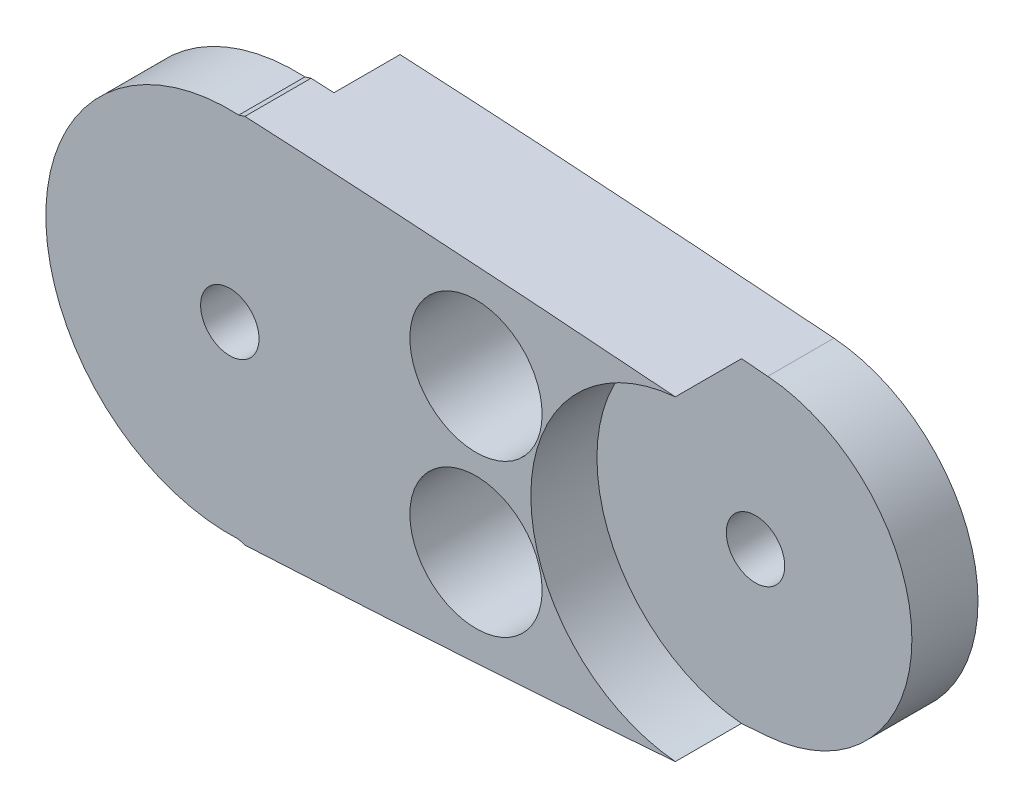
ISO-10303-21;
HEADER;
FILE_DESCRIPTION(('STEP AP214'),'2;1');
FILE_NAME('part.step','',(''),(''),'','','');
FILE_SCHEMA(('AUTOMOTIVE_DESIGN { 1 0 10303 214 1 1 1 1 }'));
ENDSEC;
DATA;
#1=APPLICATION_CONTEXT('core data for automotive mechanical design processes');
#2=APPLICATION_PROTOCOL_DEFINITION('international standard','automotive_design',2000,#1);
#3=PRODUCT_CONTEXT('',#1,'mechanical');
#4=PRODUCT('Part','Part','',(#3));
#5=PRODUCT_RELATED_PRODUCT_CATEGORY('part','',(#4));
#6=PRODUCT_DEFINITION_FORMATION('','',#4);
#7=PRODUCT_DEFINITION_CONTEXT('part definition',#1,'design');
#8=PRODUCT_DEFINITION('design','',#6,#7);
#9=PRODUCT_DEFINITION_SHAPE('','',#8);
#10=(LENGTH_UNIT() NAMED_UNIT(*) SI_UNIT(.MILLI.,.METRE.));
#11=(NAMED_UNIT(*) PLANE_ANGLE_UNIT() SI_UNIT($,.RADIAN.));
#12=(NAMED_UNIT(*) SI_UNIT($,.STERADIAN.) SOLID_ANGLE_UNIT());
#13=UNCERTAINTY_MEASURE_WITH_UNIT(LENGTH_MEASURE(1.E-05),#10,'distance_accuracy_value','');
#14=(GEOMETRIC_REPRESENTATION_CONTEXT(3) GLOBAL_UNCERTAINTY_ASSIGNED_CONTEXT((#13)) GLOBAL_UNIT_ASSIGNED_CONTEXT((#10,
#11,#12)) REPRESENTATION_CONTEXT('',''));
#15=CARTESIAN_POINT('',(0.,0.,0.));
#16=DIRECTION('',(0.,0.,1.));
#17=DIRECTION('',(1.,0.,0.));
#18=AXIS2_PLACEMENT_3D('',#15,#16,#17);
#19=CARTESIAN_POINT('',(300.,0.378,12.));
#20=CARTESIAN_POINT('',(299.845901447221,0.39961034336831,12.));
#21=CARTESIAN_POINT('',(299.230346714046,0.48593399083917,12.));
#22=CARTESIAN_POINT('',(297.848901683276,0.678531057447331,12.));
#23=CARTESIAN_POINT('',(295.556029122455,0.996787499241564,12.));
#24=CARTESIAN_POINT('',(292.365739581197,1.43343203295321,12.));
#25=CARTESIAN_POINT('',(288.297856433401,1.98344889126347,12.));
#26=CARTESIAN_POINT('',(283.377248038078,2.63572648359042,12.));
#27=CARTESIAN_POINT('',(277.63430498472,3.38149178862329,12.));
#28=CARTESIAN_POINT('',(271.104515413466,4.20901604095742,12.));
#29=CARTESIAN_POINT('',(263.828064626846,5.10718872872647,12.));
#30=CARTESIAN_POINT('',(255.849823781818,6.06276893212352,12.));
#31=CARTESIAN_POINT('',(247.21903434379,7.06424307195608,12.));
#32=CARTESIAN_POINT('',(237.988783489903,8.09787318806774,12.));
#33=CARTESIAN_POINT('',(228.216029511608,9.15107036010328,12.));
#34=CARTESIAN_POINT('',(217.961088379031,10.2107446574668,12.));
#35=CARTESIAN_POINT('',(207.287161839572,11.2632209265187,12.));
#36=CARTESIAN_POINT('',(196.260086850424,12.2937248064858,12.));
#37=CARTESIAN_POINT('',(184.947773044503,13.2887281219597,12.));
#38=CARTESIAN_POINT('',(173.420088229148,14.2315961384787,12.));
#39=CARTESIAN_POINT('',(161.747864995533,15.1069553720124,12.));
#40=CARTESIAN_POINT('',(150.00317252135,15.8985540753976,12.));
#41=CARTESIAN_POINT('',(138.258374542497,16.5898406039741,12.));
#42=CARTESIAN_POINT('',(126.585774705795,17.1633504747405,12.));
#43=CARTESIAN_POINT('',(115.057462615139,17.6037905135667,12.));
#44=CARTESIAN_POINT('',(103.744181572864,17.8967919128621,12.));
#45=CARTESIAN_POINT('',(92.7158453472272,18.0280433746414,12.));
#46=CARTESIAN_POINT('',(82.0402185013839,17.9871287273908,12.));
#47=CARTESIAN_POINT('',(71.7831190583338,17.7661449762132,12.));
#48=CARTESIAN_POINT('',(62.0076841473254,17.3594904245971,12.));
#49=CARTESIAN_POINT('',(52.7740834437817,16.7661013276277,12.));
#50=CARTESIAN_POINT('',(44.1390669938569,15.987763153894,12.));
#51=CARTESIAN_POINT('',(36.1554749512941,15.0305547578774,12.));
#52=CARTESIAN_POINT('',(28.8719698679608,13.9026205663682,12.));
#53=CARTESIAN_POINT('',(22.3326880228315,12.6157408879695,12.));
#54=CARTESIAN_POINT('',(16.5759570466198,11.1844668147641,12.));
#55=CARTESIAN_POINT('',(11.6344891822112,9.62275505380201,12.));
#56=CARTESIAN_POINT('',(7.53339032845527,7.94515078115887,12.));
#57=CARTESIAN_POINT('',(4.28573900369485,6.16300377839948,12.));
#58=CARTESIAN_POINT('',(1.8965325692393,4.27279663699588,12.));
#59=CARTESIAN_POINT('',(0.366265286449645,2.2288009510305,12.));
#60=CARTESIAN_POINT('',(-0.170692645797294,0.,12.));
#61=CARTESIAN_POINT('',(0.366265286449666,-2.22880095103055,12.));
#62=CARTESIAN_POINT('',(1.89653256923925,-4.27279663699582,12.));
#63=CARTESIAN_POINT('',(4.28573900369493,-6.16300377839955,12.));
#64=CARTESIAN_POINT('',(7.53339032845521,-7.94515078115883,12.));
#65=CARTESIAN_POINT('',(11.6344891822112,-9.62275505380201,12.));
#66=CARTESIAN_POINT('',(16.5759570466199,-11.1844668147641,12.));
#67=CARTESIAN_POINT('',(22.3326880228314,-12.6157408879695,12.));
#68=CARTESIAN_POINT('',(28.8719698679608,-13.9026205663682,12.));
#69=CARTESIAN_POINT('',(36.155474951294,-15.0305547578773,12.));
#70=CARTESIAN_POINT('',(44.1390669938569,-15.987763153894,12.));
#71=CARTESIAN_POINT('',(52.7740834437817,-16.7661013276277,12.));
#72=CARTESIAN_POINT('',(62.0076841473254,-17.3594904245971,12.));
#73=CARTESIAN_POINT('',(71.7831190583338,-17.7661449762132,12.));
#74=CARTESIAN_POINT('',(82.0402185013839,-17.9871287273908,12.));
#75=CARTESIAN_POINT('',(92.7158453472273,-18.0280433746414,12.));
#76=CARTESIAN_POINT('',(103.744181572864,-17.8967919128621,12.));
#77=CARTESIAN_POINT('',(115.057462615139,-17.6037905135667,12.));
#78=CARTESIAN_POINT('',(126.585774705795,-17.1633504747405,12.));
#79=CARTESIAN_POINT('',(138.258374542497,-16.5898406039741,12.));
#80=CARTESIAN_POINT('',(150.00317252135,-15.8985540753976,12.));
#81=CARTESIAN_POINT('',(161.747864995533,-15.1069553720124,12.));
#82=CARTESIAN_POINT('',(173.420088229148,-14.2315961384787,12.));
#83=CARTESIAN_POINT('',(184.947773044503,-13.2887281219597,12.));
#84=CARTESIAN_POINT('',(196.260086850424,-12.2937248064858,12.));
#85=CARTESIAN_POINT('',(207.287161839572,-11.2632209265187,12.));
#86=CARTESIAN_POINT('',(217.961088379031,-10.2107446574668,12.));
#87=CARTESIAN_POINT('',(228.216029511608,-9.15107036010328,12.));
#88=CARTESIAN_POINT('',(237.988783489903,-8.09787318806774,12.));
#89=CARTESIAN_POINT('',(247.21903434379,-7.06424307195608,12.));
#90=CARTESIAN_POINT('',(255.849823781818,-6.0627689321235,12.));
#91=CARTESIAN_POINT('',(263.828064626846,-5.10718872872648,12.));
#92=CARTESIAN_POINT('',(271.104515413466,-4.20901604095741,12.));
#93=CARTESIAN_POINT('',(277.63430498472,-3.38149178862329,12.));
#94=CARTESIAN_POINT('',(283.377248038078,-2.63572648359043,12.));
#95=CARTESIAN_POINT('',(288.297856433401,-1.98344889126346,12.));
#96=CARTESIAN_POINT('',(292.365739581198,-1.43343203295321,12.));
#97=CARTESIAN_POINT('',(295.556029122455,-0.996787499241567,12.));
#98=CARTESIAN_POINT('',(297.848901683276,-0.678531057447318,12.));
#99=CARTESIAN_POINT('',(299.230346714046,-0.48593399083919,12.));
#100=CARTESIAN_POINT('',(299.845901447221,-0.399610343368311,12.));
#101=CARTESIAN_POINT('',(300.,-0.378,12.));
#102=B_SPLINE_CURVE_WITH_KNOTS('',3,(#19,#20,#21,#22,#23,#24,#25,#26,#27,#28,#29,#30,#31,#32,
#33,#34,#35,#36,#37,#38,#39,#40,#41,#42,#43,#44,#45,#46,#47,#48,#49,#50,#51,#52,#53,#54,#55,#56,
#57,#58,#59,#60,#61,#62,#63,#64,#65,#66,#67,#68,#69,#70,#71,#72,#73,#74,#75,#76,#77,#78,#79,#80,
#81,#82,#83,#84,#85,#86,#87,#88,#89,#90,#91,#92,#93,#94,#95,#96,#97,#98,#99,#100,#101),
.UNSPECIFIED.,.F.,.F.,(4,1,1,1,1,1,1,1,1,1,1,1,1,1,1,1,1,1,1,1,1,1,1,1,1,1,1,1,1,1,1,1,1,1,1,1,
1,1,1,1,1,1,1,1,1,1,1,1,1,1,1,1,1,1,1,1,1,1,1,1,1,1,1,1,1,1,1,1,1,1,1,1,1,1,1,1,1,1,1,1,4),(0.,
0.000763156679271448,0.00304846929193477,0.00684068957953669,0.0121161317605396,
0.0188407924276644,0.0269727495182071,0.0364598537113803,0.0472429445210447,0.0592535547279477,
0.0724172643119224,0.0866510217067198,0.101866322474926,0.117968955401192,0.134857918638583,
0.152428309483259,0.170571841082248,0.189174521814913,0.208122338288737,0.227296649324545,
0.246580070424687,0.265853108019993,0.284996761496293,0.303895241632262,0.322432580929281,
0.340498658943124,0.357984483489282,0.37478811429809,0.390812303248415,0.405965006366899,
0.420162443159487,0.433328264782086,0.445393603392471,0.456301171479378,0.466003880875037,
0.474472000637231,0.481696232103684,0.487703697963338,0.492583405321472,0.496543603187854,0.5,
0.503456396812145,0.507416594678528,0.512296302036662,0.518303767896316,0.525527999362769,
0.533996119124963,0.543698828520622,0.554606396607529,0.566671735217914,0.579837556840513,
0.594034993633101,0.609187696751585,0.62521188570191,0.642015516510718,0.659501341056876,
0.677567419070719,0.696104758367738,0.715003238503707,0.734146891980006,0.753419929575313,
0.772703350675454,0.791877661711263,0.810825478185087,0.829428158917752,0.847571690516741,
0.865142081361417,0.882031044598807,0.898133677525074,0.91334897829328,0.927582735688077,
0.940746445272052,0.952757055478955,0.96354014628862,0.973027250481793,0.981159207572336,
0.98788386823946,0.993159310420463,0.996951530708065,0.999236843320729,1.),.UNSPECIFIED.);
#103=DIRECTION('',(0.,0.,-1.));
#104=VECTOR('',#103,1.);
#105=SURFACE_OF_LINEAR_EXTRUSION('',#102,#104);
#106=DIRECTION('',(0.,0.,1.));
#107=VECTOR('',#106,1.);
#108=CARTESIAN_POINT('',(132.876380649796,-16.8492060079631,2.));
#109=LINE('',#108,#107);
#110=CARTESIAN_POINT('',(132.876380649796,-16.8492060079631,6.));
#111=VERTEX_POINT('',#110);
#112=CARTESIAN_POINT('',(132.876380649796,-16.8492060079631,12.));
#113=VERTEX_POINT('',#112);
#114=EDGE_CURVE('E240',#111,#113,#109,.T.);
#115=ORIENTED_EDGE('',*,*,#114,.F.);
#116=CARTESIAN_POINT('',(132.328689217383,-16.8761314999039,6.));
#117=CARTESIAN_POINT('',(133.20326203618,-16.8333474917898,6.));
#118=CARTESIAN_POINT('',(134.077785352439,-16.7895504439011,6.));
#119=CARTESIAN_POINT('',(134.952258251261,-16.7447693497227,6.));
#120=B_SPLINE_CURVE_WITH_KNOTS('',3,(#116,#117,#118,#119),.UNSPECIFIED.,.F.,.F.,(4,4),
(0.724485045812363,0.72877941322724),.UNSPECIFIED.);
#121=CARTESIAN_POINT('',(134.952258251261,-16.7447693497227,6.));
#122=VERTEX_POINT('',#121);
#123=EDGE_CURVE('E243',#111,#122,#120,.T.);
#124=ORIENTED_EDGE('',*,*,#123,.T.);
#125=DIRECTION('',(0.,0.,1.));
#126=VECTOR('',#125,1.);
#127=CARTESIAN_POINT('',(134.952258251261,-16.7447693497227,0.));
#128=LINE('',#127,#126);
#129=CARTESIAN_POINT('',(134.952258251261,-16.7447693497227,0.));
#130=VERTEX_POINT('',#129);
#131=EDGE_CURVE('E282',#130,#122,#128,.T.);
#132=ORIENTED_EDGE('',*,*,#131,.F.);
#133=CARTESIAN_POINT('',(300.,0.378,0.));
#134=CARTESIAN_POINT('',(299.845901447221,0.39961034336831,0.));
#135=CARTESIAN_POINT('',(299.230346714046,0.48593399083917,0.));
#136=CARTESIAN_POINT('',(297.848901683276,0.678531057447331,0.));
#137=CARTESIAN_POINT('',(295.556029122455,0.996787499241564,0.));
#138=CARTESIAN_POINT('',(292.365739581197,1.43343203295321,0.));
#139=CARTESIAN_POINT('',(288.297856433401,1.98344889126347,0.));
#140=CARTESIAN_POINT('',(283.377248038078,2.63572648359042,0.));
#141=CARTESIAN_POINT('',(277.63430498472,3.38149178862329,0.));
#142=CARTESIAN_POINT('',(271.104515413466,4.20901604095742,0.));
#143=CARTESIAN_POINT('',(263.828064626846,5.10718872872647,0.));
#144=CARTESIAN_POINT('',(255.849823781818,6.06276893212352,0.));
#145=CARTESIAN_POINT('',(247.21903434379,7.06424307195608,0.));
#146=CARTESIAN_POINT('',(237.988783489903,8.09787318806774,0.));
#147=CARTESIAN_POINT('',(228.216029511608,9.15107036010328,0.));
#148=CARTESIAN_POINT('',(217.961088379031,10.2107446574668,0.));
#149=CARTESIAN_POINT('',(207.287161839572,11.2632209265187,0.));
#150=CARTESIAN_POINT('',(196.260086850424,12.2937248064858,0.));
#151=CARTESIAN_POINT('',(184.947773044503,13.2887281219597,0.));
#152=CARTESIAN_POINT('',(173.420088229148,14.2315961384787,0.));
#153=CARTESIAN_POINT('',(161.747864995533,15.1069553720124,0.));
#154=CARTESIAN_POINT('',(150.00317252135,15.8985540753976,0.));
#155=CARTESIAN_POINT('',(138.258374542497,16.5898406039741,0.));
#156=CARTESIAN_POINT('',(126.585774705795,17.1633504747405,0.));
#157=CARTESIAN_POINT('',(115.057462615139,17.6037905135667,0.));
#158=CARTESIAN_POINT('',(103.744181572864,17.8967919128621,0.));
#159=CARTESIAN_POINT('',(92.7158453472272,18.0280433746414,0.));
#160=CARTESIAN_POINT('',(82.0402185013839,17.9871287273908,0.));
#161=CARTESIAN_POINT('',(71.7831190583338,17.7661449762132,0.));
#162=CARTESIAN_POINT('',(62.0076841473254,17.3594904245971,0.));
#163=CARTESIAN_POINT('',(52.7740834437817,16.7661013276277,0.));
#164=CARTESIAN_POINT('',(44.1390669938569,15.987763153894,0.));
#165=CARTESIAN_POINT('',(36.1554749512941,15.0305547578774,0.));
#166=CARTESIAN_POINT('',(28.8719698679608,13.9026205663682,0.));
#167=CARTESIAN_POINT('',(22.3326880228315,12.6157408879695,0.));
#168=CARTESIAN_POINT('',(16.5759570466198,11.1844668147641,0.));
#169=CARTESIAN_POINT('',(11.6344891822112,9.62275505380201,0.));
#170=CARTESIAN_POINT('',(7.53339032845527,7.94515078115887,0.));
#171=CARTESIAN_POINT('',(4.28573900369485,6.16300377839948,0.));
#172=CARTESIAN_POINT('',(1.8965325692393,4.27279663699588,0.));
#173=CARTESIAN_POINT('',(0.366265286449645,2.2288009510305,0.));
#174=CARTESIAN_POINT('',(-0.170692645797294,0.,0.));
#175=CARTESIAN_POINT('',(0.366265286449666,-2.22880095103055,0.));
#176=CARTESIAN_POINT('',(1.89653256923925,-4.27279663699582,0.));
#177=CARTESIAN_POINT('',(4.28573900369493,-6.16300377839955,0.));
#178=CARTESIAN_POINT('',(7.53339032845521,-7.94515078115883,0.));
#179=CARTESIAN_POINT('',(11.6344891822112,-9.62275505380201,0.));
#180=CARTESIAN_POINT('',(16.5759570466199,-11.1844668147641,0.));
#181=CARTESIAN_POINT('',(22.3326880228314,-12.6157408879695,0.));
#182=CARTESIAN_POINT('',(28.8719698679608,-13.9026205663682,0.));
#183=CARTESIAN_POINT('',(36.155474951294,-15.0305547578773,0.));
#184=CARTESIAN_POINT('',(44.1390669938569,-15.987763153894,0.));
#185=CARTESIAN_POINT('',(52.7740834437817,-16.7661013276277,0.));
#186=CARTESIAN_POINT('',(62.0076841473254,-17.3594904245971,0.));
#187=CARTESIAN_POINT('',(71.7831190583338,-17.7661449762132,0.));
#188=CARTESIAN_POINT('',(82.0402185013839,-17.9871287273908,0.));
#189=CARTESIAN_POINT('',(92.7158453472273,-18.0280433746414,0.));
#190=CARTESIAN_POINT('',(103.744181572864,-17.8967919128621,0.));
#191=CARTESIAN_POINT('',(115.057462615139,-17.6037905135667,0.));
#192=CARTESIAN_POINT('',(126.585774705795,-17.1633504747405,0.));
#193=CARTESIAN_POINT('',(138.258374542497,-16.5898406039741,0.));
#194=CARTESIAN_POINT('',(150.00317252135,-15.8985540753976,0.));
#195=CARTESIAN_POINT('',(161.747864995533,-15.1069553720124,0.));
#196=CARTESIAN_POINT('',(173.420088229148,-14.2315961384787,0.));
#197=CARTESIAN_POINT('',(184.947773044503,-13.2887281219597,0.));
#198=CARTESIAN_POINT('',(196.260086850424,-12.2937248064858,0.));
#199=CARTESIAN_POINT('',(207.287161839572,-11.2632209265187,0.));
#200=CARTESIAN_POINT('',(217.961088379031,-10.2107446574668,0.));
#201=CARTESIAN_POINT('',(228.216029511608,-9.15107036010328,0.));
#202=CARTESIAN_POINT('',(237.988783489903,-8.09787318806774,0.));
#203=CARTESIAN_POINT('',(247.21903434379,-7.06424307195608,0.));
#204=CARTESIAN_POINT('',(255.849823781818,-6.0627689321235,0.));
#205=CARTESIAN_POINT('',(263.828064626846,-5.10718872872648,0.));
#206=CARTESIAN_POINT('',(271.104515413466,-4.20901604095741,0.));
#207=CARTESIAN_POINT('',(277.63430498472,-3.38149178862329,0.));
#208=CARTESIAN_POINT('',(283.377248038078,-2.63572648359043,0.));
#209=CARTESIAN_POINT('',(288.297856433401,-1.98344889126346,0.));
#210=CARTESIAN_POINT('',(292.365739581198,-1.43343203295321,0.));
#211=CARTESIAN_POINT('',(295.556029122455,-0.996787499241567,0.));
#212=CARTESIAN_POINT('',(297.848901683276,-0.678531057447318,0.));
#213=CARTESIAN_POINT('',(299.230346714046,-0.48593399083919,0.));
#214=CARTESIAN_POINT('',(299.845901447221,-0.399610343368311,0.));
#215=CARTESIAN_POINT('',(300.,-0.378,0.));
#216=B_SPLINE_CURVE_WITH_KNOTS('',3,(#133,#134,#135,#136,#137,#138,#139,#140,#141,#142,#143,
#144,#145,#146,#147,#148,#149,#150,#151,#152,#153,#154,#155,#156,#157,#158,#159,#160,#161,#162,
#163,#164,#165,#166,#167,#168,#169,#170,#171,#172,#173,#174,#175,#176,#177,#178,#179,#180,#181,
#182,#183,#184,#185,#186,#187,#188,#189,#190,#191,#192,#193,#194,#195,#196,#197,#198,#199,#200,
#201,#202,#203,#204,#205,#206,#207,#208,#209,#210,#211,#212,#213,#214,#215),.UNSPECIFIED.,.F.,
.F.,(4,1,1,1,1,1,1,1,1,1,1,1,1,1,1,1,1,1,1,1,1,1,1,1,1,1,1,1,1,1,1,1,1,1,1,1,1,1,1,1,1,1,1,1,1,
1,1,1,1,1,1,1,1,1,1,1,1,1,1,1,1,1,1,1,1,1,1,1,1,1,1,1,1,1,1,1,1,1,1,1,4),(0.,
0.000763156679271448,0.00304846929193477,0.00684068957953669,0.0121161317605396,
0.0188407924276644,0.0269727495182071,0.0364598537113803,0.0472429445210447,0.0592535547279477,
0.0724172643119224,0.0866510217067198,0.101866322474926,0.117968955401192,0.134857918638583,
0.152428309483259,0.170571841082248,0.189174521814913,0.208122338288737,0.227296649324545,
0.246580070424687,0.265853108019993,0.284996761496293,0.303895241632262,0.322432580929281,
0.340498658943124,0.357984483489282,0.37478811429809,0.390812303248415,0.405965006366899,
0.420162443159487,0.433328264782086,0.445393603392471,0.456301171479378,0.466003880875037,
0.474472000637231,0.481696232103684,0.487703697963338,0.492583405321472,0.496543603187854,0.5,
0.503456396812145,0.507416594678528,0.512296302036662,0.518303767896316,0.525527999362769,
0.533996119124963,0.543698828520622,0.554606396607529,0.566671735217914,0.579837556840513,
0.594034993633101,0.609187696751585,0.62521188570191,0.642015516510718,0.659501341056876,
0.677567419070719,0.696104758367738,0.715003238503707,0.734146891980006,0.753419929575313,
0.772703350675454,0.791877661711263,0.810825478185087,0.829428158917752,0.847571690516741,
0.865142081361417,0.882031044598807,0.898133677525074,0.91334897829328,0.927582735688077,
0.940746445272052,0.952757055478955,0.96354014628862,0.973027250481793,0.981159207572336,
0.98788386823946,0.993159310420463,0.996951530708065,0.999236843320729,1.),.UNSPECIFIED.);
#217=CARTESIAN_POINT('',(174.328689217383,-14.1469660874353,0.));
#218=VERTEX_POINT('',#217);
#219=EDGE_CURVE('E169',#130,#218,#216,.T.);
#220=ORIENTED_EDGE('',*,*,#219,.T.);
#221=DIRECTION('',(0.,0.,-1.));
#222=VECTOR('',#221,1.);
#223=CARTESIAN_POINT('',(174.328689217383,-14.1469660874353,12.));
#224=LINE('',#223,#222);
#225=CARTESIAN_POINT('',(174.328689217383,-14.1469660874353,6.));
#226=VERTEX_POINT('',#225);
#227=EDGE_CURVE('E346',#226,#218,#224,.T.);
#228=ORIENTED_EDGE('',*,*,#227,.F.);
#229=CARTESIAN_POINT('',(171.935214382284,-14.3341749040965,6.));
#230=CARTESIAN_POINT('',(172.733082975334,-14.2723306483047,6.));
#231=CARTESIAN_POINT('',(173.530907897925,-14.2099238815219,6.));
#232=CARTESIAN_POINT('',(174.328689217383,-14.1469660874353,6.));
#233=B_SPLINE_CURVE_WITH_KNOTS('',3,(#229,#230,#231,#232),.UNSPECIFIED.,.F.,.F.,(4,4),
(0.789369019023404,0.793293816771685),.UNSPECIFIED.);
#234=CARTESIAN_POINT('',(171.935214382284,-14.3341749040965,6.));
#235=VERTEX_POINT('',#234);
#236=EDGE_CURVE('E71',#235,#226,#233,.T.);
#237=ORIENTED_EDGE('',*,*,#236,.F.);
#238=DIRECTION('',(0.,0.,-1.));
#239=VECTOR('',#238,1.);
#240=CARTESIAN_POINT('',(171.935214382284,-14.3341749040965,12.));
#241=LINE('',#240,#239);
#242=CARTESIAN_POINT('',(171.935214382284,-14.3341749040965,12.));
#243=VERTEX_POINT('',#242);
#244=EDGE_CURVE('E294',#243,#235,#241,.T.);
#245=ORIENTED_EDGE('',*,*,#244,.F.);
#246=EDGE_CURVE('E159',#113,#243,#102,.T.);
#247=ORIENTED_EDGE('',*,*,#246,.F.);
#248=EDGE_LOOP('',(#115,#124,#132,#220,#228,#237,#245,#247));
#249=FACE_BOUND('',#248,.T.);
#250=ADVANCED_FACE('F45',(#249),#105,.F.);
#251=CARTESIAN_POINT('',(0.,0.,12.));
#252=DIRECTION('',(0.,0.,1.));
#253=DIRECTION('',(1.,0.,0.));
#254=AXIS2_PLACEMENT_3D('',#251,#252,#253);
#255=PLANE('',#254);
#256=CARTESIAN_POINT('',(153.84397923188,6.92074033532109,12.));
#257=DIRECTION('',(0.,0.,1.));
#258=DIRECTION('',(1.,0.,0.));
#259=AXIS2_PLACEMENT_3D('',#256,#257,#258);
#260=CIRCLE('',#259,6.00000000000002);
#261=CARTESIAN_POINT('',(159.84397923188,6.92074033532109,12.));
#262=VERTEX_POINT('',#261);
#263=EDGE_CURVE('E379',#262,#262,#260,.T.);
#264=ORIENTED_EDGE('',*,*,#263,.F.);
#265=EDGE_LOOP('',(#264));
#266=FACE_BOUND('',#265,.T.);
#267=CARTESIAN_POINT('',(153.84397923188,-6.91759312923557,12.));
#268=DIRECTION('',(0.,0.,1.));
#269=DIRECTION('',(-1.,0.,0.));
#270=AXIS2_PLACEMENT_3D('',#267,#268,#269);
#271=CIRCLE('',#270,6.00000000000002);
#272=CARTESIAN_POINT('',(147.84397923188,-6.91759312923557,12.));
#273=VERTEX_POINT('',#272);
#274=EDGE_CURVE('E375',#273,#273,#271,.T.);
#275=ORIENTED_EDGE('',*,*,#274,.F.);
#276=EDGE_LOOP('',(#275));
#277=FACE_BOUND('',#276,.T.);
#278=CARTESIAN_POINT('',(131.503110680875,0.,12.));
#279=DIRECTION('',(0.,0.,1.));
#280=DIRECTION('',(1.,0.,0.));
#281=AXIS2_PLACEMENT_3D('',#278,#279,#280);
#282=CIRCLE('',#281,2.65000000000001);
#283=CARTESIAN_POINT('',(134.153110680875,0.,12.));
#284=VERTEX_POINT('',#283);
#285=EDGE_CURVE('E320',#284,#284,#282,.T.);
#286=ORIENTED_EDGE('',*,*,#285,.F.);
#287=EDGE_LOOP('',(#286));
#288=FACE_BOUND('',#287,.T.);
#289=CARTESIAN_POINT('',(131.503110680875,0.,12.));
#290=DIRECTION('',(0.,0.,1.));
#291=DIRECTION('',(1.,0.,0.));
#292=AXIS2_PLACEMENT_3D('',#289,#290,#291);
#293=CIRCLE('',#292,16.6963130392992);
#294=CARTESIAN_POINT('',(132.322060357678,16.6762163134548,12.));
#295=VERTEX_POINT('',#294);
#296=CARTESIAN_POINT('',(132.318916925231,-16.6763703868061,12.));
#297=VERTEX_POINT('',#296);
#298=EDGE_CURVE('E135',#295,#297,#293,.T.);
#299=ORIENTED_EDGE('',*,*,#298,.T.);
#300=DIRECTION('',(0.955146729870803,-0.296132950576444,0.));
#301=VECTOR('',#300,1.);
#302=CARTESIAN_POINT('',(6.88675259778333,22.212520458793,12.));
#303=LINE('',#302,#301);
#304=EDGE_CURVE('E132',#297,#113,#303,.T.);
#305=ORIENTED_EDGE('',*,*,#304,.T.);
#306=ORIENTED_EDGE('',*,*,#246,.T.);
#307=CARTESIAN_POINT('',(173.212265813218,0.,12.));
#308=DIRECTION('',(0.,0.,1.));
#309=DIRECTION('',(1.,0.,0.));
#310=AXIS2_PLACEMENT_3D('',#307,#308,#309);
#311=CIRCLE('',#310,14.3909496051678);
#312=CARTESIAN_POINT('',(171.935214303548,14.3341748970818,12.));
#313=VERTEX_POINT('',#312);
#314=EDGE_CURVE('E290',#313,#243,#311,.T.);
#315=ORIENTED_EDGE('',*,*,#314,.F.);
#316=CARTESIAN_POINT('',(300.,0.378,12.));
#317=CARTESIAN_POINT('',(299.845901447221,0.39961034336831,12.));
#318=CARTESIAN_POINT('',(299.230346714046,0.48593399083917,12.));
#319=CARTESIAN_POINT('',(297.848901683276,0.678531057447331,12.));
#320=CARTESIAN_POINT('',(295.556029122455,0.996787499241564,12.));
#321=CARTESIAN_POINT('',(292.365739581197,1.43343203295321,12.));
#322=CARTESIAN_POINT('',(288.297856433401,1.98344889126347,12.));
#323=CARTESIAN_POINT('',(283.377248038078,2.63572648359042,12.));
#324=CARTESIAN_POINT('',(277.63430498472,3.38149178862329,12.));
#325=CARTESIAN_POINT('',(271.104515413466,4.20901604095742,12.));
#326=CARTESIAN_POINT('',(263.828064626846,5.10718872872647,12.));
#327=CARTESIAN_POINT('',(255.849823781818,6.06276893212352,12.));
#328=CARTESIAN_POINT('',(247.21903434379,7.06424307195608,12.));
#329=CARTESIAN_POINT('',(237.988783489903,8.09787318806774,12.));
#330=CARTESIAN_POINT('',(228.216029511608,9.15107036010328,12.));
#331=CARTESIAN_POINT('',(217.961088379031,10.2107446574668,12.));
#332=CARTESIAN_POINT('',(207.287161839572,11.2632209265187,12.));
#333=CARTESIAN_POINT('',(196.260086850424,12.2937248064858,12.));
#334=CARTESIAN_POINT('',(184.947773044503,13.2887281219597,12.));
#335=CARTESIAN_POINT('',(173.420088229148,14.2315961384787,12.));
#336=CARTESIAN_POINT('',(161.747864995533,15.1069553720124,12.));
#337=CARTESIAN_POINT('',(150.00317252135,15.8985540753976,12.));
#338=CARTESIAN_POINT('',(138.258374542497,16.5898406039741,12.));
#339=CARTESIAN_POINT('',(126.585774705795,17.1633504747405,12.));
#340=CARTESIAN_POINT('',(115.057462615139,17.6037905135667,12.));
#341=CARTESIAN_POINT('',(103.744181572864,17.8967919128621,12.));
#342=CARTESIAN_POINT('',(92.7158453472272,18.0280433746414,12.));
#343=CARTESIAN_POINT('',(82.0402185013839,17.9871287273908,12.));
#344=CARTESIAN_POINT('',(71.7831190583338,17.7661449762132,12.));
#345=CARTESIAN_POINT('',(62.0076841473254,17.3594904245971,12.));
#346=CARTESIAN_POINT('',(52.7740834437817,16.7661013276277,12.));
#347=CARTESIAN_POINT('',(44.1390669938569,15.987763153894,12.));
#348=CARTESIAN_POINT('',(36.1554749512941,15.0305547578774,12.));
#349=CARTESIAN_POINT('',(28.8719698679608,13.9026205663682,12.));
#350=CARTESIAN_POINT('',(22.3326880228315,12.6157408879695,12.));
#351=CARTESIAN_POINT('',(16.5759570466198,11.1844668147641,12.));
#352=CARTESIAN_POINT('',(11.6344891822112,9.62275505380201,12.));
#353=CARTESIAN_POINT('',(7.53339032845527,7.94515078115887,12.));
#354=CARTESIAN_POINT('',(4.28573900369485,6.16300377839948,12.));
#355=CARTESIAN_POINT('',(1.8965325692393,4.27279663699588,12.));
#356=CARTESIAN_POINT('',(0.366265286449645,2.2288009510305,12.));
#357=CARTESIAN_POINT('',(-0.170692645797294,0.,12.));
#358=CARTESIAN_POINT('',(0.366265286449666,-2.22880095103055,12.));
#359=CARTESIAN_POINT('',(1.89653256923925,-4.27279663699582,12.));
#360=CARTESIAN_POINT('',(4.28573900369493,-6.16300377839955,12.));
#361=CARTESIAN_POINT('',(7.53339032845521,-7.94515078115883,12.));
#362=CARTESIAN_POINT('',(11.6344891822112,-9.62275505380201,12.));
#363=CARTESIAN_POINT('',(16.5759570466199,-11.1844668147641,12.));
#364=CARTESIAN_POINT('',(22.3326880228314,-12.6157408879695,12.));
#365=CARTESIAN_POINT('',(28.8719698679608,-13.9026205663682,12.));
#366=CARTESIAN_POINT('',(36.155474951294,-15.0305547578773,12.));
#367=CARTESIAN_POINT('',(44.1390669938569,-15.987763153894,12.));
#368=CARTESIAN_POINT('',(52.7740834437817,-16.7661013276277,12.));
#369=CARTESIAN_POINT('',(62.0076841473254,-17.3594904245971,12.));
#370=CARTESIAN_POINT('',(71.7831190583338,-17.7661449762132,12.));
#371=CARTESIAN_POINT('',(82.0402185013839,-17.9871287273908,12.));
#372=CARTESIAN_POINT('',(92.7158453472273,-18.0280433746414,12.));
#373=CARTESIAN_POINT('',(103.744181572864,-17.8967919128621,12.));
#374=CARTESIAN_POINT('',(115.057462615139,-17.6037905135667,12.));
#375=CARTESIAN_POINT('',(126.585774705795,-17.1633504747405,12.));
#376=CARTESIAN_POINT('',(138.258374542497,-16.5898406039741,12.));
#377=CARTESIAN_POINT('',(150.00317252135,-15.8985540753976,12.));
#378=CARTESIAN_POINT('',(161.747864995533,-15.1069553720124,12.));
#379=CARTESIAN_POINT('',(173.420088229148,-14.2315961384787,12.));
#380=CARTESIAN_POINT('',(184.947773044503,-13.2887281219597,12.));
#381=CARTESIAN_POINT('',(196.260086850424,-12.2937248064858,12.));
#382=CARTESIAN_POINT('',(207.287161839572,-11.2632209265187,12.));
#383=CARTESIAN_POINT('',(217.961088379031,-10.2107446574668,12.));
#384=CARTESIAN_POINT('',(228.216029511608,-9.15107036010328,12.));
#385=CARTESIAN_POINT('',(237.988783489903,-8.09787318806774,12.));
#386=CARTESIAN_POINT('',(247.21903434379,-7.06424307195608,12.));
#387=CARTESIAN_POINT('',(255.849823781818,-6.0627689321235,12.));
#388=CARTESIAN_POINT('',(263.828064626846,-5.10718872872648,12.));
#389=CARTESIAN_POINT('',(271.104515413466,-4.20901604095741,12.));
#390=CARTESIAN_POINT('',(277.63430498472,-3.38149178862329,12.));
#391=CARTESIAN_POINT('',(283.377248038078,-2.63572648359043,12.));
#392=CARTESIAN_POINT('',(288.297856433401,-1.98344889126346,12.));
#393=CARTESIAN_POINT('',(292.365739581198,-1.43343203295321,12.));
#394=CARTESIAN_POINT('',(295.556029122455,-0.996787499241567,12.));
#395=CARTESIAN_POINT('',(297.848901683276,-0.678531057447318,12.));
#396=CARTESIAN_POINT('',(299.230346714046,-0.48593399083919,12.));
#397=CARTESIAN_POINT('',(299.845901447221,-0.399610343368311,12.));
#398=CARTESIAN_POINT('',(300.,-0.378,12.));
#399=B_SPLINE_CURVE_WITH_KNOTS('',3,(#316,#317,#318,#319,#320,#321,#322,#323,#324,#325,#326,
#327,#328,#329,#330,#331,#332,#333,#334,#335,#336,#337,#338,#339,#340,#341,#342,#343,#344,#345,
#346,#347,#348,#349,#350,#351,#352,#353,#354,#355,#356,#357,#358,#359,#360,#361,#362,#363,#364,
#365,#366,#367,#368,#369,#370,#371,#372,#373,#374,#375,#376,#377,#378,#379,#380,#381,#382,#383,
#384,#385,#386,#387,#388,#389,#390,#391,#392,#393,#394,#395,#396,#397,#398),.UNSPECIFIED.,.F.,
.F.,(4,1,1,1,1,1,1,1,1,1,1,1,1,1,1,1,1,1,1,1,1,1,1,1,1,1,1,1,1,1,1,1,1,1,1,1,1,1,1,1,1,1,1,1,1,
1,1,1,1,1,1,1,1,1,1,1,1,1,1,1,1,1,1,1,1,1,1,1,1,1,1,1,1,1,1,1,1,1,1,1,4),(0.,
0.000763156679271448,0.00304846929193477,0.00684068957953669,0.0121161317605396,
0.0188407924276644,0.0269727495182071,0.0364598537113803,0.0472429445210447,0.0592535547279477,
0.0724172643119224,0.0866510217067198,0.101866322474926,0.117968955401192,0.134857918638583,
0.152428309483259,0.170571841082248,0.189174521814913,0.208122338288737,0.227296649324545,
0.246580070424687,0.265853108019993,0.284996761496293,0.303895241632262,0.322432580929281,
0.340498658943124,0.357984483489282,0.37478811429809,0.390812303248415,0.405965006366899,
0.420162443159487,0.433328264782086,0.445393603392471,0.456301171479378,0.466003880875037,
0.474472000637231,0.481696232103684,0.487703697963338,0.492583405321472,0.496543603187854,0.5,
0.503456396812145,0.507416594678528,0.512296302036662,0.518303767896316,0.525527999362769,
0.533996119124963,0.543698828520622,0.554606396607529,0.566671735217914,0.579837556840513,
0.594034993633101,0.609187696751585,0.62521188570191,0.642015516510718,0.659501341056876,
0.677567419070719,0.696104758367738,0.715003238503707,0.734146891980006,0.753419929575313,
0.772703350675454,0.791877661711263,0.810825478185087,0.829428158917752,0.847571690516741,
0.865142081361417,0.882031044598807,0.898133677525074,0.91334897829328,0.927582735688077,
0.940746445272052,0.952757055478955,0.96354014628862,0.973027250481793,0.981159207572336,
0.98788386823946,0.993159310420463,0.996951530708065,0.999236843320729,1.),.UNSPECIFIED.);
#400=CARTESIAN_POINT('',(132.876380649788,16.8492060079635,12.));
#401=VERTEX_POINT('',#400);
#402=EDGE_CURVE('E149',#313,#401,#399,.T.);
#403=ORIENTED_EDGE('',*,*,#402,.T.);
#404=DIRECTION('',(0.954595316774749,0.29790565820695,0.));
#405=VECTOR('',#404,1.);
#406=CARTESIAN_POINT('',(7.00091776773299,-22.4334218907666,12.));
#407=LINE('',#406,#405);
#408=EDGE_CURVE('E127',#295,#401,#407,.T.);
#409=ORIENTED_EDGE('',*,*,#408,.F.);
#410=EDGE_LOOP('',(#299,#305,#306,#315,#403,#409));
#411=FACE_BOUND('',#410,.T.);
#412=ADVANCED_FACE('F146',(#266,#277,#288,#411),#255,.T.);
#413=CARTESIAN_POINT('',(0.,0.,6.));
#414=DIRECTION('',(0.,0.,1.));
#415=DIRECTION('',(1.,0.,0.));
#416=AXIS2_PLACEMENT_3D('',#413,#414,#415);
#417=PLANE('',#416);
#418=CARTESIAN_POINT('',(131.503110680875,0.,6.));
#419=DIRECTION('',(0.,0.,1.));
#420=DIRECTION('',(1.,0.,0.));
#421=AXIS2_PLACEMENT_3D('',#418,#419,#420);
#422=CIRCLE('',#421,2.65000000000001);
#423=CARTESIAN_POINT('',(134.153110680875,0.,6.));
#424=VERTEX_POINT('',#423);
#425=EDGE_CURVE('E319',#424,#424,#422,.T.);
#426=ORIENTED_EDGE('',*,*,#425,.T.);
#427=EDGE_LOOP('',(#426));
#428=FACE_BOUND('',#427,.T.);
#429=DIRECTION('',(0.955146729870803,-0.296132950576444,0.));
#430=VECTOR('',#429,1.);
#431=CARTESIAN_POINT('',(6.88675259778333,22.212520458793,6.));
#432=LINE('',#431,#430);
#433=CARTESIAN_POINT('',(132.318916925231,-16.6763703868061,6.));
#434=VERTEX_POINT('',#433);
#435=EDGE_CURVE('E11',#434,#111,#432,.T.);
#436=ORIENTED_EDGE('',*,*,#435,.F.);
#437=CARTESIAN_POINT('',(131.503110680875,0.,6.));
#438=DIRECTION('',(0.,0.,1.));
#439=DIRECTION('',(1.,0.,0.));
#440=AXIS2_PLACEMENT_3D('',#437,#438,#439);
#441=CIRCLE('',#440,16.6963130392992);
#442=CARTESIAN_POINT('',(132.322060357678,16.6762163134548,6.));
#443=VERTEX_POINT('',#442);
#444=EDGE_CURVE('E55',#443,#434,#441,.T.);
#445=ORIENTED_EDGE('',*,*,#444,.F.);
#446=DIRECTION('',(0.954595316774749,0.29790565820695,0.));
#447=VECTOR('',#446,1.);
#448=CARTESIAN_POINT('',(7.00091776773299,-22.4334218907666,6.));
#449=LINE('',#448,#447);
#450=CARTESIAN_POINT('',(132.876380651781,16.8492060078942,6.));
#451=VERTEX_POINT('',#450);
#452=EDGE_CURVE('E128',#443,#451,#449,.T.);
#453=ORIENTED_EDGE('',*,*,#452,.T.);
#454=CARTESIAN_POINT('',(134.95225825126,16.7447693497228,6.));
#455=CARTESIAN_POINT('',(134.077785352439,16.7895504439012,6.));
#456=CARTESIAN_POINT('',(133.20326203618,16.8333474917898,6.));
#457=CARTESIAN_POINT('',(132.328689217383,16.8761314999039,6.));
#458=B_SPLINE_CURVE_WITH_KNOTS('',3,(#454,#455,#456,#457),.UNSPECIFIED.,.F.,.F.,(4,4),
(0.27122058677272,0.275514954187593),.UNSPECIFIED.);
#459=CARTESIAN_POINT('',(134.95225825126,16.7447693497228,6.));
#460=VERTEX_POINT('',#459);
#461=EDGE_CURVE('E254',#460,#451,#458,.T.);
#462=ORIENTED_EDGE('',*,*,#461,.F.);
#463=CARTESIAN_POINT('',(131.503110680875,0.,6.));
#464=DIRECTION('',(0.,0.,-1.));
#465=DIRECTION('',(-1.,0.,0.));
#466=AXIS2_PLACEMENT_3D('',#463,#464,#465);
#467=CIRCLE('',#466,17.0963130392992);
#468=EDGE_CURVE('E252',#460,#122,#467,.T.);
#469=ORIENTED_EDGE('',*,*,#468,.T.);
#470=ORIENTED_EDGE('',*,*,#123,.F.);
#471=EDGE_LOOP('',(#436,#445,#453,#462,#469,#470));
#472=FACE_BOUND('',#471,.T.);
#473=ADVANCED_FACE('F181',(#428,#472),#417,.F.);
#474=DIRECTION('',(0.,0.,-1.));
#475=VECTOR('',#474,1.);
#476=SURFACE_OF_LINEAR_EXTRUSION('',#399,#475);
#477=ORIENTED_EDGE('',*,*,#461,.T.);
#478=DIRECTION('',(0.,0.,1.));
#479=VECTOR('',#478,1.);
#480=CARTESIAN_POINT('',(132.876380649788,16.8492060079635,2.));
#481=LINE('',#480,#479);
#482=EDGE_CURVE('E63',#451,#401,#481,.T.);
#483=ORIENTED_EDGE('',*,*,#482,.T.);
#484=ORIENTED_EDGE('',*,*,#402,.F.);
#485=DIRECTION('',(0.,0.,-1.));
#486=VECTOR('',#485,1.);
#487=CARTESIAN_POINT('',(171.935214303548,14.3341748970818,12.));
#488=LINE('',#487,#486);
#489=CARTESIAN_POINT('',(171.935214303548,14.3341748970818,6.));
#490=VERTEX_POINT('',#489);
#491=EDGE_CURVE('E315',#313,#490,#488,.T.);
#492=ORIENTED_EDGE('',*,*,#491,.T.);
#493=CARTESIAN_POINT('',(174.328689217383,14.1469660874353,6.));
#494=CARTESIAN_POINT('',(173.530907871679,14.2099238792194,6.));
#495=CARTESIAN_POINT('',(172.733082922843,14.2723306436643,6.));
#496=CARTESIAN_POINT('',(171.935214303548,14.3341748970818,6.));
#497=B_SPLINE_CURVE_WITH_KNOTS('',3,(#493,#494,#495,#496),.UNSPECIFIED.,.F.,.F.,(4,4),
(0.206706183228315,0.210630981099095),.UNSPECIFIED.);
#498=CARTESIAN_POINT('',(174.328689217383,14.1469660874353,6.));
#499=VERTEX_POINT('',#498);
#500=EDGE_CURVE('E289',#499,#490,#497,.T.);
#501=ORIENTED_EDGE('',*,*,#500,.F.);
#502=DIRECTION('',(0.,0.,-1.));
#503=VECTOR('',#502,1.);
#504=CARTESIAN_POINT('',(174.328689217383,14.1469660874353,12.));
#505=LINE('',#504,#503);
#506=CARTESIAN_POINT('',(174.328689217374,14.146966087436,0.));
#507=VERTEX_POINT('',#506);
#508=EDGE_CURVE('E337',#499,#507,#505,.T.);
#509=ORIENTED_EDGE('',*,*,#508,.T.);
#510=CARTESIAN_POINT('',(300.,0.378,0.));
#511=CARTESIAN_POINT('',(299.845901447221,0.39961034336831,0.));
#512=CARTESIAN_POINT('',(299.230346714046,0.48593399083917,0.));
#513=CARTESIAN_POINT('',(297.848901683276,0.678531057447331,0.));
#514=CARTESIAN_POINT('',(295.556029122455,0.996787499241564,0.));
#515=CARTESIAN_POINT('',(292.365739581197,1.43343203295321,0.));
#516=CARTESIAN_POINT('',(288.297856433401,1.98344889126347,0.));
#517=CARTESIAN_POINT('',(283.377248038078,2.63572648359042,0.));
#518=CARTESIAN_POINT('',(277.63430498472,3.38149178862329,0.));
#519=CARTESIAN_POINT('',(271.104515413466,4.20901604095742,0.));
#520=CARTESIAN_POINT('',(263.828064626846,5.10718872872647,0.));
#521=CARTESIAN_POINT('',(255.849823781818,6.06276893212352,0.));
#522=CARTESIAN_POINT('',(247.21903434379,7.06424307195608,0.));
#523=CARTESIAN_POINT('',(237.988783489903,8.09787318806774,0.));
#524=CARTESIAN_POINT('',(228.216029511608,9.15107036010328,0.));
#525=CARTESIAN_POINT('',(217.961088379031,10.2107446574668,0.));
#526=CARTESIAN_POINT('',(207.287161839572,11.2632209265187,0.));
#527=CARTESIAN_POINT('',(196.260086850424,12.2937248064858,0.));
#528=CARTESIAN_POINT('',(184.947773044503,13.2887281219597,0.));
#529=CARTESIAN_POINT('',(173.420088229148,14.2315961384787,0.));
#530=CARTESIAN_POINT('',(161.747864995533,15.1069553720124,0.));
#531=CARTESIAN_POINT('',(150.00317252135,15.8985540753976,0.));
#532=CARTESIAN_POINT('',(138.258374542497,16.5898406039741,0.));
#533=CARTESIAN_POINT('',(126.585774705795,17.1633504747405,0.));
#534=CARTESIAN_POINT('',(115.057462615139,17.6037905135667,0.));
#535=CARTESIAN_POINT('',(103.744181572864,17.8967919128621,0.));
#536=CARTESIAN_POINT('',(92.7158453472272,18.0280433746414,0.));
#537=CARTESIAN_POINT('',(82.0402185013839,17.9871287273908,0.));
#538=CARTESIAN_POINT('',(71.7831190583338,17.7661449762132,0.));
#539=CARTESIAN_POINT('',(62.0076841473254,17.3594904245971,0.));
#540=CARTESIAN_POINT('',(52.7740834437817,16.7661013276277,0.));
#541=CARTESIAN_POINT('',(44.1390669938569,15.987763153894,0.));
#542=CARTESIAN_POINT('',(36.1554749512941,15.0305547578774,0.));
#543=CARTESIAN_POINT('',(28.8719698679608,13.9026205663682,0.));
#544=CARTESIAN_POINT('',(22.3326880228315,12.6157408879695,0.));
#545=CARTESIAN_POINT('',(16.5759570466198,11.1844668147641,0.));
#546=CARTESIAN_POINT('',(11.6344891822112,9.62275505380201,0.));
#547=CARTESIAN_POINT('',(7.53339032845527,7.94515078115887,0.));
#548=CARTESIAN_POINT('',(4.28573900369485,6.16300377839948,0.));
#549=CARTESIAN_POINT('',(1.8965325692393,4.27279663699588,0.));
#550=CARTESIAN_POINT('',(0.366265286449645,2.2288009510305,0.));
#551=CARTESIAN_POINT('',(-0.170692645797294,0.,0.));
#552=CARTESIAN_POINT('',(0.366265286449666,-2.22880095103055,0.));
#553=CARTESIAN_POINT('',(1.89653256923925,-4.27279663699582,0.));
#554=CARTESIAN_POINT('',(4.28573900369493,-6.16300377839955,0.));
#555=CARTESIAN_POINT('',(7.53339032845521,-7.94515078115883,0.));
#556=CARTESIAN_POINT('',(11.6344891822112,-9.62275505380201,0.));
#557=CARTESIAN_POINT('',(16.5759570466199,-11.1844668147641,0.));
#558=CARTESIAN_POINT('',(22.3326880228314,-12.6157408879695,0.));
#559=CARTESIAN_POINT('',(28.8719698679608,-13.9026205663682,0.));
#560=CARTESIAN_POINT('',(36.155474951294,-15.0305547578773,0.));
#561=CARTESIAN_POINT('',(44.1390669938569,-15.987763153894,0.));
#562=CARTESIAN_POINT('',(52.7740834437817,-16.7661013276277,0.));
#563=CARTESIAN_POINT('',(62.0076841473254,-17.3594904245971,0.));
#564=CARTESIAN_POINT('',(71.7831190583338,-17.7661449762132,0.));
#565=CARTESIAN_POINT('',(82.0402185013839,-17.9871287273908,0.));
#566=CARTESIAN_POINT('',(92.7158453472273,-18.0280433746414,0.));
#567=CARTESIAN_POINT('',(103.744181572864,-17.8967919128621,0.));
#568=CARTESIAN_POINT('',(115.057462615139,-17.6037905135667,0.));
#569=CARTESIAN_POINT('',(126.585774705795,-17.1633504747405,0.));
#570=CARTESIAN_POINT('',(138.258374542497,-16.5898406039741,0.));
#571=CARTESIAN_POINT('',(150.00317252135,-15.8985540753976,0.));
#572=CARTESIAN_POINT('',(161.747864995533,-15.1069553720124,0.));
#573=CARTESIAN_POINT('',(173.420088229148,-14.2315961384787,0.));
#574=CARTESIAN_POINT('',(184.947773044503,-13.2887281219597,0.));
#575=CARTESIAN_POINT('',(196.260086850424,-12.2937248064858,0.));
#576=CARTESIAN_POINT('',(207.287161839572,-11.2632209265187,0.));
#577=CARTESIAN_POINT('',(217.961088379031,-10.2107446574668,0.));
#578=CARTESIAN_POINT('',(228.216029511608,-9.15107036010328,0.));
#579=CARTESIAN_POINT('',(237.988783489903,-8.09787318806774,0.));
#580=CARTESIAN_POINT('',(247.21903434379,-7.06424307195608,0.));
#581=CARTESIAN_POINT('',(255.849823781818,-6.0627689321235,0.));
#582=CARTESIAN_POINT('',(263.828064626846,-5.10718872872648,0.));
#583=CARTESIAN_POINT('',(271.104515413466,-4.20901604095741,0.));
#584=CARTESIAN_POINT('',(277.63430498472,-3.38149178862329,0.));
#585=CARTESIAN_POINT('',(283.377248038078,-2.63572648359043,0.));
#586=CARTESIAN_POINT('',(288.297856433401,-1.98344889126346,0.));
#587=CARTESIAN_POINT('',(292.365739581198,-1.43343203295321,0.));
#588=CARTESIAN_POINT('',(295.556029122455,-0.996787499241567,0.));
#589=CARTESIAN_POINT('',(297.848901683276,-0.678531057447318,0.));
#590=CARTESIAN_POINT('',(299.230346714046,-0.48593399083919,0.));
#591=CARTESIAN_POINT('',(299.845901447221,-0.399610343368311,0.));
#592=CARTESIAN_POINT('',(300.,-0.378,0.));
#593=B_SPLINE_CURVE_WITH_KNOTS('',3,(#510,#511,#512,#513,#514,#515,#516,#517,#518,#519,#520,
#521,#522,#523,#524,#525,#526,#527,#528,#529,#530,#531,#532,#533,#534,#535,#536,#537,#538,#539,
#540,#541,#542,#543,#544,#545,#546,#547,#548,#549,#550,#551,#552,#553,#554,#555,#556,#557,#558,
#559,#560,#561,#562,#563,#564,#565,#566,#567,#568,#569,#570,#571,#572,#573,#574,#575,#576,#577,
#578,#579,#580,#581,#582,#583,#584,#585,#586,#587,#588,#589,#590,#591,#592),.UNSPECIFIED.,.F.,
.F.,(4,1,1,1,1,1,1,1,1,1,1,1,1,1,1,1,1,1,1,1,1,1,1,1,1,1,1,1,1,1,1,1,1,1,1,1,1,1,1,1,1,1,1,1,1,
1,1,1,1,1,1,1,1,1,1,1,1,1,1,1,1,1,1,1,1,1,1,1,1,1,1,1,1,1,1,1,1,1,1,1,4),(0.,
0.000763156679271448,0.00304846929193477,0.00684068957953669,0.0121161317605396,
0.0188407924276644,0.0269727495182071,0.0364598537113803,0.0472429445210447,0.0592535547279477,
0.0724172643119224,0.0866510217067198,0.101866322474926,0.117968955401192,0.134857918638583,
0.152428309483259,0.170571841082248,0.189174521814913,0.208122338288737,0.227296649324545,
0.246580070424687,0.265853108019993,0.284996761496293,0.303895241632262,0.322432580929281,
0.340498658943124,0.357984483489282,0.37478811429809,0.390812303248415,0.405965006366899,
0.420162443159487,0.433328264782086,0.445393603392471,0.456301171479378,0.466003880875037,
0.474472000637231,0.481696232103684,0.487703697963338,0.492583405321472,0.496543603187854,0.5,
0.503456396812145,0.507416594678528,0.512296302036662,0.518303767896316,0.525527999362769,
0.533996119124963,0.543698828520622,0.554606396607529,0.566671735217914,0.579837556840513,
0.594034993633101,0.609187696751585,0.62521188570191,0.642015516510718,0.659501341056876,
0.677567419070719,0.696104758367738,0.715003238503707,0.734146891980006,0.753419929575313,
0.772703350675454,0.791877661711263,0.810825478185087,0.829428158917752,0.847571690516741,
0.865142081361417,0.882031044598807,0.898133677525074,0.91334897829328,0.927582735688077,
0.940746445272052,0.952757055478955,0.96354014628862,0.973027250481793,0.981159207572336,
0.98788386823946,0.993159310420463,0.996951530708065,0.999236843320729,1.),.UNSPECIFIED.);
#594=CARTESIAN_POINT('',(134.95225825126,16.7447693497228,0.));
#595=VERTEX_POINT('',#594);
#596=EDGE_CURVE('E351',#507,#595,#593,.T.);
#597=ORIENTED_EDGE('',*,*,#596,.T.);
#598=DIRECTION('',(0.,0.,1.));
#599=VECTOR('',#598,1.);
#600=CARTESIAN_POINT('',(134.95225825126,16.7447693497228,0.));
#601=LINE('',#600,#599);
#602=EDGE_CURVE('E285',#595,#460,#601,.T.);
#603=ORIENTED_EDGE('',*,*,#602,.T.);
#604=EDGE_LOOP('',(#477,#483,#484,#492,#501,#509,#597,#603));
#605=FACE_BOUND('',#604,.T.);
#606=ADVANCED_FACE('F177',(#605),#476,.F.);
#607=CARTESIAN_POINT('',(0.,0.,0.));
#608=DIRECTION('',(0.,0.,1.));
#609=DIRECTION('',(1.,0.,0.));
#610=AXIS2_PLACEMENT_3D('',#607,#608,#609);
#611=PLANE('',#610);
#612=CARTESIAN_POINT('',(153.84397923188,6.92074033532109,0.));
#613=DIRECTION('',(0.,0.,1.));
#614=DIRECTION('',(1.,0.,0.));
#615=AXIS2_PLACEMENT_3D('',#612,#613,#614);
#616=CIRCLE('',#615,6.00000000000002);
#617=CARTESIAN_POINT('',(159.84397923188,6.92074033532109,0.));
#618=VERTEX_POINT('',#617);
#619=EDGE_CURVE('E143',#618,#618,#616,.T.);
#620=ORIENTED_EDGE('',*,*,#619,.T.);
#621=EDGE_LOOP('',(#620));
#622=FACE_BOUND('',#621,.T.);
#623=CARTESIAN_POINT('',(153.84397923188,-6.91759312923557,0.));
#624=DIRECTION('',(0.,0.,1.));
#625=DIRECTION('',(-1.,0.,0.));
#626=AXIS2_PLACEMENT_3D('',#623,#624,#625);
#627=CIRCLE('',#626,6.00000000000002);
#628=CARTESIAN_POINT('',(147.84397923188,-6.91759312923557,0.));
#629=VERTEX_POINT('',#628);
#630=EDGE_CURVE('E371',#629,#629,#627,.T.);
#631=ORIENTED_EDGE('',*,*,#630,.T.);
#632=EDGE_LOOP('',(#631));
#633=FACE_BOUND('',#632,.T.);
#634=CARTESIAN_POINT('',(131.503110680875,0.,0.));
#635=DIRECTION('',(0.,0.,-1.));
#636=DIRECTION('',(-1.,0.,0.));
#637=AXIS2_PLACEMENT_3D('',#634,#635,#636);
#638=CIRCLE('',#637,17.0963130392992);
#639=EDGE_CURVE('E269',#595,#130,#638,.T.);
#640=ORIENTED_EDGE('',*,*,#639,.F.);
#641=ORIENTED_EDGE('',*,*,#596,.F.);
#642=CARTESIAN_POINT('',(173.212265813218,0.,0.));
#643=DIRECTION('',(0.,0.,1.));
#644=DIRECTION('',(1.,0.,0.));
#645=AXIS2_PLACEMENT_3D('',#642,#643,#644);
#646=CIRCLE('',#645,14.1909496051678);
#647=EDGE_CURVE('E324',#507,#218,#646,.F.);
#648=ORIENTED_EDGE('',*,*,#647,.T.);
#649=ORIENTED_EDGE('',*,*,#219,.F.);
#650=EDGE_LOOP('',(#640,#641,#648,#649));
#651=FACE_BOUND('',#650,.T.);
#652=CARTESIAN_POINT('',(173.212265813218,0.,0.));
#653=DIRECTION('',(0.,0.,1.));
#654=DIRECTION('',(1.,0.,0.));
#655=AXIS2_PLACEMENT_3D('',#652,#653,#654);
#656=CIRCLE('',#655,2.65000000000001);
#657=CARTESIAN_POINT('',(175.862265813218,0.,0.));
#658=VERTEX_POINT('',#657);
#659=EDGE_CURVE('E333',#658,#658,#656,.T.);
#660=ORIENTED_EDGE('',*,*,#659,.T.);
#661=EDGE_LOOP('',(#660));
#662=FACE_BOUND('',#661,.T.);
#663=ADVANCED_FACE('F180',(#622,#633,#651,#662),#611,.F.);
#664=CARTESIAN_POINT('',(173.212265813218,0.,6.));
#665=DIRECTION('',(0.,0.,-1.));
#666=DIRECTION('',(-1.,0.,0.));
#667=AXIS2_PLACEMENT_3D('',#664,#665,#666);
#668=CYLINDRICAL_SURFACE('',#667,14.1909496051678);
#669=CARTESIAN_POINT('',(173.212265813218,0.,6.));
#670=DIRECTION('',(0.,0.,1.));
#671=DIRECTION('',(1.,0.,0.));
#672=AXIS2_PLACEMENT_3D('',#669,#670,#671);
#673=CIRCLE('',#672,14.1909496051678);
#674=EDGE_CURVE('E328',#499,#226,#673,.F.);
#675=ORIENTED_EDGE('',*,*,#674,.T.);
#676=ORIENTED_EDGE('',*,*,#227,.T.);
#677=ORIENTED_EDGE('',*,*,#647,.F.);
#678=ORIENTED_EDGE('',*,*,#508,.F.);
#679=EDGE_LOOP('',(#675,#676,#677,#678));
#680=FACE_BOUND('',#679,.T.);
#681=ADVANCED_FACE('F185',(#680),#668,.T.);
#682=CARTESIAN_POINT('',(173.212265813218,0.,6.));
#683=DIRECTION('',(0.,0.,-1.));
#684=DIRECTION('',(-1.,0.,0.));
#685=AXIS2_PLACEMENT_3D('',#682,#683,#684);
#686=CYLINDRICAL_SURFACE('',#685,2.65000000000001);
#687=CARTESIAN_POINT('',(173.212265813218,0.,6.));
#688=DIRECTION('',(0.,0.,1.));
#689=DIRECTION('',(1.,0.,0.));
#690=AXIS2_PLACEMENT_3D('',#687,#688,#689);
#691=CIRCLE('',#690,2.65000000000001);
#692=CARTESIAN_POINT('',(175.862265813218,0.,6.));
#693=VERTEX_POINT('',#692);
#694=EDGE_CURVE('E332',#693,#693,#691,.T.);
#695=ORIENTED_EDGE('',*,*,#694,.T.);
#696=EDGE_LOOP('',(#695));
#697=FACE_BOUND('',#696,.T.);
#698=ORIENTED_EDGE('',*,*,#659,.F.);
#699=EDGE_LOOP('',(#698));
#700=FACE_BOUND('',#699,.T.);
#701=ADVANCED_FACE('F192',(#697,#700),#686,.F.);
#702=CARTESIAN_POINT('',(0.,0.,6.));
#703=DIRECTION('',(0.,0.,1.));
#704=DIRECTION('',(1.,0.,0.));
#705=AXIS2_PLACEMENT_3D('',#702,#703,#704);
#706=PLANE('',#705);
#707=ORIENTED_EDGE('',*,*,#674,.F.);
#708=ORIENTED_EDGE('',*,*,#500,.T.);
#709=CARTESIAN_POINT('',(173.212265813218,0.,6.));
#710=DIRECTION('',(0.,0.,1.));
#711=DIRECTION('',(1.,0.,0.));
#712=AXIS2_PLACEMENT_3D('',#709,#710,#711);
#713=CIRCLE('',#712,14.3909496051678);
#714=EDGE_CURVE('E299',#490,#235,#713,.T.);
#715=ORIENTED_EDGE('',*,*,#714,.T.);
#716=ORIENTED_EDGE('',*,*,#236,.T.);
#717=EDGE_LOOP('',(#707,#708,#715,#716));
#718=FACE_BOUND('',#717,.T.);
#719=ORIENTED_EDGE('',*,*,#694,.F.);
#720=EDGE_LOOP('',(#719));
#721=FACE_BOUND('',#720,.T.);
#722=ADVANCED_FACE('F196',(#718,#721),#706,.T.);
#723=CARTESIAN_POINT('',(131.503110680875,0.,12.));
#724=DIRECTION('',(0.,0.,-1.));
#725=DIRECTION('',(-1.,0.,0.));
#726=AXIS2_PLACEMENT_3D('',#723,#724,#725);
#727=CYLINDRICAL_SURFACE('',#726,2.65000000000001);
#728=ORIENTED_EDGE('',*,*,#285,.T.);
#729=EDGE_LOOP('',(#728));
#730=FACE_BOUND('',#729,.T.);
#731=ORIENTED_EDGE('',*,*,#425,.F.);
#732=EDGE_LOOP('',(#731));
#733=FACE_BOUND('',#732,.T.);
#734=ADVANCED_FACE('F200',(#730,#733),#727,.F.);
#735=CARTESIAN_POINT('',(173.212265813218,0.,12.));
#736=DIRECTION('',(0.,0.,-1.));
#737=DIRECTION('',(-1.,0.,0.));
#738=AXIS2_PLACEMENT_3D('',#735,#736,#737);
#739=CYLINDRICAL_SURFACE('',#738,14.3909496051678);
#740=ORIENTED_EDGE('',*,*,#714,.F.);
#741=ORIENTED_EDGE('',*,*,#491,.F.);
#742=ORIENTED_EDGE('',*,*,#314,.T.);
#743=ORIENTED_EDGE('',*,*,#244,.T.);
#744=EDGE_LOOP('',(#740,#741,#742,#743));
#745=FACE_BOUND('',#744,.T.);
#746=ADVANCED_FACE('F203',(#745),#739,.F.);
#747=CARTESIAN_POINT('',(131.503110680875,0.,0.));
#748=DIRECTION('',(0.,0.,1.));
#749=DIRECTION('',(1.,0.,0.));
#750=AXIS2_PLACEMENT_3D('',#747,#748,#749);
#751=CYLINDRICAL_SURFACE('',#750,17.0963130392992);
#752=ORIENTED_EDGE('',*,*,#468,.F.);
#753=ORIENTED_EDGE('',*,*,#602,.F.);
#754=ORIENTED_EDGE('',*,*,#639,.T.);
#755=ORIENTED_EDGE('',*,*,#131,.T.);
#756=EDGE_LOOP('',(#752,#753,#754,#755));
#757=FACE_BOUND('',#756,.T.);
#758=ADVANCED_FACE('F210',(#757),#751,.F.);
#759=CARTESIAN_POINT('',(131.503110680875,0.,2.));
#760=DIRECTION('',(0.,0.,1.));
#761=DIRECTION('',(1.,0.,0.));
#762=AXIS2_PLACEMENT_3D('',#759,#760,#761);
#763=CYLINDRICAL_SURFACE('',#762,16.6963130392992);
#764=ORIENTED_EDGE('',*,*,#444,.T.);
#765=DIRECTION('',(0.,0.,1.));
#766=VECTOR('',#765,1.);
#767=CARTESIAN_POINT('',(132.318916925231,-16.6763703868061,2.));
#768=LINE('',#767,#766);
#769=EDGE_CURVE('E138',#434,#297,#768,.T.);
#770=ORIENTED_EDGE('',*,*,#769,.T.);
#771=ORIENTED_EDGE('',*,*,#298,.F.);
#772=DIRECTION('',(0.,0.,1.));
#773=VECTOR('',#772,1.);
#774=CARTESIAN_POINT('',(132.322060357678,16.6762163134548,2.));
#775=LINE('',#774,#773);
#776=EDGE_CURVE('E123',#443,#295,#775,.T.);
#777=ORIENTED_EDGE('',*,*,#776,.F.);
#778=EDGE_LOOP('',(#764,#770,#771,#777));
#779=FACE_BOUND('',#778,.T.);
#780=ADVANCED_FACE('F136',(#779),#763,.T.);
#781=CARTESIAN_POINT('',(6.88675259778333,22.212520458793,2.));
#782=DIRECTION('',(-0.296132950576444,-0.955146729870803,0.));
#783=DIRECTION('',(0.955146729870803,-0.296132950576444,0.));
#784=AXIS2_PLACEMENT_3D('',#781,#782,#783);
#785=PLANE('',#784);
#786=ORIENTED_EDGE('',*,*,#435,.T.);
#787=ORIENTED_EDGE('',*,*,#114,.T.);
#788=ORIENTED_EDGE('',*,*,#304,.F.);
#789=ORIENTED_EDGE('',*,*,#769,.F.);
#790=EDGE_LOOP('',(#786,#787,#788,#789));
#791=FACE_BOUND('',#790,.T.);
#792=ADVANCED_FACE('F217',(#791),#785,.T.);
#793=CARTESIAN_POINT('',(7.00091776773299,-22.4334218907666,2.));
#794=DIRECTION('',(0.29790565820695,-0.954595316774749,0.));
#795=DIRECTION('',(0.954595316774749,0.29790565820695,0.));
#796=AXIS2_PLACEMENT_3D('',#793,#794,#795);
#797=PLANE('',#796);
#798=ORIENTED_EDGE('',*,*,#776,.T.);
#799=ORIENTED_EDGE('',*,*,#408,.T.);
#800=ORIENTED_EDGE('',*,*,#482,.F.);
#801=ORIENTED_EDGE('',*,*,#452,.F.);
#802=EDGE_LOOP('',(#798,#799,#800,#801));
#803=FACE_BOUND('',#802,.T.);
#804=ADVANCED_FACE('F125',(#803),#797,.F.);
#805=CARTESIAN_POINT('',(153.84397923188,-6.91759312923557,0.));
#806=DIRECTION('',(0.,0.,1.));
#807=DIRECTION('',(1.,0.,0.));
#808=AXIS2_PLACEMENT_3D('',#805,#806,#807);
#809=CYLINDRICAL_SURFACE('',#808,6.00000000000002);
#810=ORIENTED_EDGE('',*,*,#630,.F.);
#811=EDGE_LOOP('',(#810));
#812=FACE_BOUND('',#811,.T.);
#813=ORIENTED_EDGE('',*,*,#274,.T.);
#814=EDGE_LOOP('',(#813));
#815=FACE_BOUND('',#814,.T.);
#816=ADVANCED_FACE('F220',(#812,#815),#809,.F.);
#817=CARTESIAN_POINT('',(153.84397923188,6.92074033532109,0.));
#818=DIRECTION('',(0.,0.,1.));
#819=DIRECTION('',(1.,0.,0.));
#820=AXIS2_PLACEMENT_3D('',#817,#818,#819);
#821=CYLINDRICAL_SURFACE('',#820,6.00000000000002);
#822=ORIENTED_EDGE('',*,*,#619,.F.);
#823=EDGE_LOOP('',(#822));
#824=FACE_BOUND('',#823,.T.);
#825=ORIENTED_EDGE('',*,*,#263,.T.);
#826=EDGE_LOOP('',(#825));
#827=FACE_BOUND('',#826,.T.);
#828=ADVANCED_FACE('F226',(#824,#827),#821,.F.);
#829=CLOSED_SHELL('',(#250,#412,#473,#606,#663,#681,#701,#722,#734,#746,#758,#780,#792,#804,
#816,#828));
#830=MANIFOLD_SOLID_BREP('B2',#829);
#831=ADVANCED_BREP_SHAPE_REPRESENTATION('',(#18,#830),#14);
#832=SHAPE_DEFINITION_REPRESENTATION(#9,#831);
ENDSEC;
END-ISO-10303-21;
